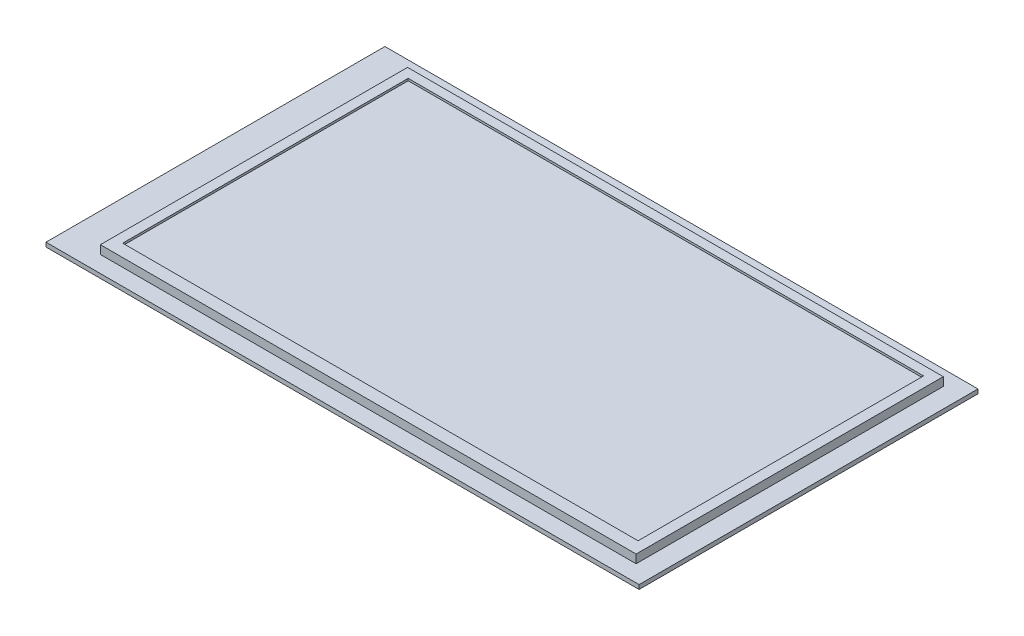
ISO-10303-21;
HEADER;
FILE_DESCRIPTION(('STEP AP214'),'2;1');
FILE_NAME('part.step','',(''),(''),'','','');
FILE_SCHEMA(('AUTOMOTIVE_DESIGN { 1 0 10303 214 1 1 1 1 }'));
ENDSEC;
DATA;
#1=APPLICATION_CONTEXT('core data for automotive mechanical design processes');
#2=APPLICATION_PROTOCOL_DEFINITION('international standard','automotive_design',2000,#1);
#3=PRODUCT_CONTEXT('',#1,'mechanical');
#4=PRODUCT('Part','Part','',(#3));
#5=PRODUCT_RELATED_PRODUCT_CATEGORY('part','',(#4));
#6=PRODUCT_DEFINITION_FORMATION('','',#4);
#7=PRODUCT_DEFINITION_CONTEXT('part definition',#1,'design');
#8=PRODUCT_DEFINITION('design','',#6,#7);
#9=PRODUCT_DEFINITION_SHAPE('','',#8);
#10=(LENGTH_UNIT() NAMED_UNIT(*) SI_UNIT(.MILLI.,.METRE.));
#11=(NAMED_UNIT(*) PLANE_ANGLE_UNIT() SI_UNIT($,.RADIAN.));
#12=(NAMED_UNIT(*) SI_UNIT($,.STERADIAN.) SOLID_ANGLE_UNIT());
#13=UNCERTAINTY_MEASURE_WITH_UNIT(LENGTH_MEASURE(1.E-05),#10,'distance_accuracy_value','');
#14=(GEOMETRIC_REPRESENTATION_CONTEXT(3) GLOBAL_UNCERTAINTY_ASSIGNED_CONTEXT((#13)) GLOBAL_UNIT_ASSIGNED_CONTEXT((#10,
#11,#12)) REPRESENTATION_CONTEXT('',''));
#15=CARTESIAN_POINT('',(0.,0.,0.));
#16=DIRECTION('',(0.,0.,1.));
#17=DIRECTION('',(1.,0.,0.));
#18=AXIS2_PLACEMENT_3D('',#15,#16,#17);
#19=CARTESIAN_POINT('',(0.,1.,0.));
#20=DIRECTION('',(1.,0.,0.));
#21=DIRECTION('',(0.,0.,-1.));
#22=AXIS2_PLACEMENT_3D('',#19,#20,#21);
#23=PLANE('',#22);
#24=DIRECTION('',(0.,0.,1.));
#25=VECTOR('',#24,1.);
#26=CARTESIAN_POINT('',(0.,0.,0.));
#27=LINE('',#26,#25);
#28=CARTESIAN_POINT('',(0.,0.,0.));
#29=VERTEX_POINT('',#28);
#30=CARTESIAN_POINT('',(0.,0.,80.));
#31=VERTEX_POINT('',#30);
#32=EDGE_CURVE('E202',#29,#31,#27,.T.);
#33=ORIENTED_EDGE('',*,*,#32,.T.);
#34=DIRECTION('',(0.,-1.,0.));
#35=VECTOR('',#34,1.);
#36=CARTESIAN_POINT('',(0.,1.,80.));
#37=LINE('',#36,#35);
#38=CARTESIAN_POINT('',(0.,1.,80.));
#39=VERTEX_POINT('',#38);
#40=EDGE_CURVE('E11',#39,#31,#37,.T.);
#41=ORIENTED_EDGE('',*,*,#40,.F.);
#42=DIRECTION('',(0.,0.,1.));
#43=VECTOR('',#42,1.);
#44=CARTESIAN_POINT('',(0.,1.,0.));
#45=LINE('',#44,#43);
#46=CARTESIAN_POINT('',(0.,1.,0.));
#47=VERTEX_POINT('',#46);
#48=EDGE_CURVE('E203',#47,#39,#45,.T.);
#49=ORIENTED_EDGE('',*,*,#48,.F.);
#50=DIRECTION('',(0.,-1.,0.));
#51=VECTOR('',#50,1.);
#52=CARTESIAN_POINT('',(0.,1.,0.));
#53=LINE('',#52,#51);
#54=EDGE_CURVE('E213',#47,#29,#53,.T.);
#55=ORIENTED_EDGE('',*,*,#54,.T.);
#56=EDGE_LOOP('',(#33,#41,#49,#55));
#57=FACE_BOUND('',#56,.T.);
#58=ADVANCED_FACE('F46',(#57),#23,.F.);
#59=CARTESIAN_POINT('',(0.,1.,80.));
#60=DIRECTION('',(0.,0.,-1.));
#61=DIRECTION('',(-1.,0.,0.));
#62=AXIS2_PLACEMENT_3D('',#59,#60,#61);
#63=PLANE('',#62);
#64=DIRECTION('',(1.,0.,0.));
#65=VECTOR('',#64,1.);
#66=CARTESIAN_POINT('',(0.,0.,80.));
#67=LINE('',#66,#65);
#68=CARTESIAN_POINT('',(140.,0.,80.));
#69=VERTEX_POINT('',#68);
#70=EDGE_CURVE('E216',#31,#69,#67,.T.);
#71=ORIENTED_EDGE('',*,*,#70,.T.);
#72=DIRECTION('',(0.,-1.,0.));
#73=VECTOR('',#72,1.);
#74=CARTESIAN_POINT('',(140.,1.,80.));
#75=LINE('',#74,#73);
#76=CARTESIAN_POINT('',(140.,1.,80.));
#77=VERTEX_POINT('',#76);
#78=EDGE_CURVE('E53',#77,#69,#75,.T.);
#79=ORIENTED_EDGE('',*,*,#78,.F.);
#80=DIRECTION('',(1.,0.,0.));
#81=VECTOR('',#80,1.);
#82=CARTESIAN_POINT('',(0.,1.,80.));
#83=LINE('',#82,#81);
#84=EDGE_CURVE('E206',#39,#77,#83,.T.);
#85=ORIENTED_EDGE('',*,*,#84,.F.);
#86=ORIENTED_EDGE('',*,*,#40,.T.);
#87=EDGE_LOOP('',(#71,#79,#85,#86));
#88=FACE_BOUND('',#87,.T.);
#89=ADVANCED_FACE('F246',(#88),#63,.F.);
#90=CARTESIAN_POINT('',(140.,1.,0.));
#91=DIRECTION('',(-1.,0.,0.));
#92=DIRECTION('',(0.,0.,1.));
#93=AXIS2_PLACEMENT_3D('',#90,#91,#92);
#94=PLANE('',#93);
#95=DIRECTION('',(0.,0.,-1.));
#96=VECTOR('',#95,1.);
#97=CARTESIAN_POINT('',(140.,0.,0.));
#98=LINE('',#97,#96);
#99=CARTESIAN_POINT('',(140.,0.,0.));
#100=VERTEX_POINT('',#99);
#101=EDGE_CURVE('E218',#69,#100,#98,.T.);
#102=ORIENTED_EDGE('',*,*,#101,.T.);
#103=DIRECTION('',(0.,-1.,0.));
#104=VECTOR('',#103,1.);
#105=CARTESIAN_POINT('',(140.,1.,0.));
#106=LINE('',#105,#104);
#107=CARTESIAN_POINT('',(140.,1.,0.));
#108=VERTEX_POINT('',#107);
#109=EDGE_CURVE('E223',#108,#100,#106,.T.);
#110=ORIENTED_EDGE('',*,*,#109,.F.);
#111=DIRECTION('',(0.,0.,-1.));
#112=VECTOR('',#111,1.);
#113=CARTESIAN_POINT('',(140.,1.,0.));
#114=LINE('',#113,#112);
#115=EDGE_CURVE('E209',#77,#108,#114,.T.);
#116=ORIENTED_EDGE('',*,*,#115,.F.);
#117=ORIENTED_EDGE('',*,*,#78,.T.);
#118=EDGE_LOOP('',(#102,#110,#116,#117));
#119=FACE_BOUND('',#118,.T.);
#120=ADVANCED_FACE('F230',(#119),#94,.F.);
#121=CARTESIAN_POINT('',(0.,1.,0.));
#122=DIRECTION('',(0.,0.,1.));
#123=DIRECTION('',(1.,0.,0.));
#124=AXIS2_PLACEMENT_3D('',#121,#122,#123);
#125=PLANE('',#124);
#126=DIRECTION('',(-1.,0.,0.));
#127=VECTOR('',#126,1.);
#128=CARTESIAN_POINT('',(0.,0.,0.));
#129=LINE('',#128,#127);
#130=EDGE_CURVE('E207',#100,#29,#129,.T.);
#131=ORIENTED_EDGE('',*,*,#130,.T.);
#132=ORIENTED_EDGE('',*,*,#54,.F.);
#133=DIRECTION('',(-1.,0.,0.));
#134=VECTOR('',#133,1.);
#135=CARTESIAN_POINT('',(0.,1.,0.));
#136=LINE('',#135,#134);
#137=EDGE_CURVE('E211',#108,#47,#136,.T.);
#138=ORIENTED_EDGE('',*,*,#137,.F.);
#139=ORIENTED_EDGE('',*,*,#109,.T.);
#140=EDGE_LOOP('',(#131,#132,#138,#139));
#141=FACE_BOUND('',#140,.T.);
#142=ADVANCED_FACE('F239',(#141),#125,.F.);
#143=CARTESIAN_POINT('',(0.,1.,0.));
#144=DIRECTION('',(0.,1.,0.));
#145=DIRECTION('',(0.,0.,1.));
#146=AXIS2_PLACEMENT_3D('',#143,#144,#145);
#147=PLANE('',#146);
#148=DIRECTION('',(0.,0.,1.));
#149=VECTOR('',#148,1.);
#150=CARTESIAN_POINT('',(8.93500924885776,1.,3.5928979192557));
#151=LINE('',#150,#149);
#152=CARTESIAN_POINT('',(8.93500924885776,1.,3.5928979192557));
#153=VERTEX_POINT('',#152);
#154=CARTESIAN_POINT('',(8.93500924885777,1.,76.0979122541562));
#155=VERTEX_POINT('',#154);
#156=EDGE_CURVE('E68',#153,#155,#151,.T.);
#157=ORIENTED_EDGE('',*,*,#156,.F.);
#158=DIRECTION('',(-1.,0.,0.));
#159=VECTOR('',#158,1.);
#160=CARTESIAN_POINT('',(8.93500924885776,1.,3.5928979192557));
#161=LINE('',#160,#159);
#162=CARTESIAN_POINT('',(135.393648323375,1.,3.5928979192557));
#163=VERTEX_POINT('',#162);
#164=EDGE_CURVE('E176',#163,#153,#161,.T.);
#165=ORIENTED_EDGE('',*,*,#164,.F.);
#166=DIRECTION('',(0.,0.,-1.));
#167=VECTOR('',#166,1.);
#168=CARTESIAN_POINT('',(135.393648323375,1.,3.5928979192557));
#169=LINE('',#168,#167);
#170=CARTESIAN_POINT('',(135.393648323375,1.,76.0979122541562));
#171=VERTEX_POINT('',#170);
#172=EDGE_CURVE('E187',#171,#163,#169,.T.);
#173=ORIENTED_EDGE('',*,*,#172,.F.);
#174=DIRECTION('',(1.,0.,0.));
#175=VECTOR('',#174,1.);
#176=CARTESIAN_POINT('',(8.93500924885777,1.,76.0979122541562));
#177=LINE('',#176,#175);
#178=EDGE_CURVE('E184',#155,#171,#177,.T.);
#179=ORIENTED_EDGE('',*,*,#178,.F.);
#180=EDGE_LOOP('',(#157,#165,#173,#179));
#181=FACE_BOUND('',#180,.T.);
#182=ORIENTED_EDGE('',*,*,#48,.T.);
#183=ORIENTED_EDGE('',*,*,#84,.T.);
#184=ORIENTED_EDGE('',*,*,#115,.T.);
#185=ORIENTED_EDGE('',*,*,#137,.T.);
#186=EDGE_LOOP('',(#182,#183,#184,#185));
#187=FACE_BOUND('',#186,.T.);
#188=ADVANCED_FACE('F245',(#181,#187),#147,.T.);
#189=CARTESIAN_POINT('',(0.,0.,0.));
#190=DIRECTION('',(0.,1.,0.));
#191=DIRECTION('',(0.,0.,1.));
#192=AXIS2_PLACEMENT_3D('',#189,#190,#191);
#193=PLANE('',#192);
#194=ORIENTED_EDGE('',*,*,#32,.F.);
#195=ORIENTED_EDGE('',*,*,#130,.F.);
#196=ORIENTED_EDGE('',*,*,#101,.F.);
#197=ORIENTED_EDGE('',*,*,#70,.F.);
#198=EDGE_LOOP('',(#194,#195,#196,#197));
#199=FACE_BOUND('',#198,.T.);
#200=ADVANCED_FACE('F236',(#199),#193,.F.);
#201=CARTESIAN_POINT('',(8.93500924885776,3.,3.5928979192557));
#202=DIRECTION('',(1.,0.,0.));
#203=DIRECTION('',(0.,0.,-1.));
#204=AXIS2_PLACEMENT_3D('',#201,#202,#203);
#205=PLANE('',#204);
#206=ORIENTED_EDGE('',*,*,#156,.T.);
#207=DIRECTION('',(0.,-1.,0.));
#208=VECTOR('',#207,1.);
#209=CARTESIAN_POINT('',(8.93500924885777,3.,76.0979122541562));
#210=LINE('',#209,#208);
#211=CARTESIAN_POINT('',(8.93500924885777,3.,76.0979122541562));
#212=VERTEX_POINT('',#211);
#213=EDGE_CURVE('E199',#212,#155,#210,.T.);
#214=ORIENTED_EDGE('',*,*,#213,.F.);
#215=DIRECTION('',(0.,0.,1.));
#216=VECTOR('',#215,1.);
#217=CARTESIAN_POINT('',(8.93500924885776,3.,3.5928979192557));
#218=LINE('',#217,#216);
#219=CARTESIAN_POINT('',(8.93500924885776,3.,3.5928979192557));
#220=VERTEX_POINT('',#219);
#221=EDGE_CURVE('E172',#220,#212,#218,.T.);
#222=ORIENTED_EDGE('',*,*,#221,.F.);
#223=DIRECTION('',(0.,-1.,0.));
#224=VECTOR('',#223,1.);
#225=CARTESIAN_POINT('',(8.93500924885776,3.,3.5928979192557));
#226=LINE('',#225,#224);
#227=EDGE_CURVE('E182',#220,#153,#226,.T.);
#228=ORIENTED_EDGE('',*,*,#227,.T.);
#229=EDGE_LOOP('',(#206,#214,#222,#228));
#230=FACE_BOUND('',#229,.T.);
#231=ADVANCED_FACE('F258',(#230),#205,.F.);
#232=CARTESIAN_POINT('',(8.93500924885777,3.,76.0979122541562));
#233=DIRECTION('',(0.,0.,-1.));
#234=DIRECTION('',(-1.,0.,0.));
#235=AXIS2_PLACEMENT_3D('',#232,#233,#234);
#236=PLANE('',#235);
#237=ORIENTED_EDGE('',*,*,#178,.T.);
#238=DIRECTION('',(0.,-1.,0.));
#239=VECTOR('',#238,1.);
#240=CARTESIAN_POINT('',(135.393648323375,3.,76.0979122541562));
#241=LINE('',#240,#239);
#242=CARTESIAN_POINT('',(135.393648323375,3.,76.0979122541562));
#243=VERTEX_POINT('',#242);
#244=EDGE_CURVE('E196',#243,#171,#241,.T.);
#245=ORIENTED_EDGE('',*,*,#244,.F.);
#246=DIRECTION('',(1.,0.,0.));
#247=VECTOR('',#246,1.);
#248=CARTESIAN_POINT('',(8.93500924885777,3.,76.0979122541562));
#249=LINE('',#248,#247);
#250=EDGE_CURVE('E175',#212,#243,#249,.T.);
#251=ORIENTED_EDGE('',*,*,#250,.F.);
#252=ORIENTED_EDGE('',*,*,#213,.T.);
#253=EDGE_LOOP('',(#237,#245,#251,#252));
#254=FACE_BOUND('',#253,.T.);
#255=ADVANCED_FACE('F263',(#254),#236,.F.);
#256=CARTESIAN_POINT('',(135.393648323375,3.,3.5928979192557));
#257=DIRECTION('',(-1.,0.,0.));
#258=DIRECTION('',(0.,0.,1.));
#259=AXIS2_PLACEMENT_3D('',#256,#257,#258);
#260=PLANE('',#259);
#261=ORIENTED_EDGE('',*,*,#172,.T.);
#262=DIRECTION('',(0.,-1.,0.));
#263=VECTOR('',#262,1.);
#264=CARTESIAN_POINT('',(135.393648323375,3.,3.5928979192557));
#265=LINE('',#264,#263);
#266=CARTESIAN_POINT('',(135.393648323375,3.,3.5928979192557));
#267=VERTEX_POINT('',#266);
#268=EDGE_CURVE('E193',#267,#163,#265,.T.);
#269=ORIENTED_EDGE('',*,*,#268,.F.);
#270=DIRECTION('',(0.,0.,-1.));
#271=VECTOR('',#270,1.);
#272=CARTESIAN_POINT('',(135.393648323375,3.,3.5928979192557));
#273=LINE('',#272,#271);
#274=EDGE_CURVE('E178',#243,#267,#273,.T.);
#275=ORIENTED_EDGE('',*,*,#274,.F.);
#276=ORIENTED_EDGE('',*,*,#244,.T.);
#277=EDGE_LOOP('',(#261,#269,#275,#276));
#278=FACE_BOUND('',#277,.T.);
#279=ADVANCED_FACE('F267',(#278),#260,.F.);
#280=CARTESIAN_POINT('',(8.93500924885776,3.,3.5928979192557));
#281=DIRECTION('',(0.,0.,1.));
#282=DIRECTION('',(1.,0.,0.));
#283=AXIS2_PLACEMENT_3D('',#280,#281,#282);
#284=PLANE('',#283);
#285=ORIENTED_EDGE('',*,*,#164,.T.);
#286=ORIENTED_EDGE('',*,*,#227,.F.);
#287=DIRECTION('',(-1.,0.,0.));
#288=VECTOR('',#287,1.);
#289=CARTESIAN_POINT('',(8.93500924885776,3.,3.5928979192557));
#290=LINE('',#289,#288);
#291=EDGE_CURVE('E180',#267,#220,#290,.T.);
#292=ORIENTED_EDGE('',*,*,#291,.F.);
#293=ORIENTED_EDGE('',*,*,#268,.T.);
#294=EDGE_LOOP('',(#285,#286,#292,#293));
#295=FACE_BOUND('',#294,.T.);
#296=ADVANCED_FACE('F271',(#295),#284,.F.);
#297=CARTESIAN_POINT('',(0.,3.,0.));
#298=DIRECTION('',(0.,1.,0.));
#299=DIRECTION('',(0.,0.,1.));
#300=AXIS2_PLACEMENT_3D('',#297,#298,#299);
#301=PLANE('',#300);
#302=DIRECTION('',(1.,0.,0.));
#303=VECTOR('',#302,1.);
#304=CARTESIAN_POINT('',(11.2539329482682,3.,73.1606089015696));
#305=LINE('',#304,#303);
#306=CARTESIAN_POINT('',(11.2539329482682,3.,73.1606089015696));
#307=VERTEX_POINT('',#306);
#308=CARTESIAN_POINT('',(132.920129710671,3.,73.1606089015696));
#309=VERTEX_POINT('',#308);
#310=EDGE_CURVE('E60',#307,#309,#305,.T.);
#311=ORIENTED_EDGE('',*,*,#310,.F.);
#312=DIRECTION('',(0.,0.,1.));
#313=VECTOR('',#312,1.);
#314=CARTESIAN_POINT('',(11.2539329482682,3.,5.75722670537213));
#315=LINE('',#314,#313);
#316=CARTESIAN_POINT('',(11.2539329482682,3.,5.75722670537213));
#317=VERTEX_POINT('',#316);
#318=EDGE_CURVE('E154',#317,#307,#315,.T.);
#319=ORIENTED_EDGE('',*,*,#318,.F.);
#320=DIRECTION('',(1.,0.,0.));
#321=VECTOR('',#320,1.);
#322=CARTESIAN_POINT('',(11.2539329482682,3.,5.75722670537213));
#323=LINE('',#322,#321);
#324=CARTESIAN_POINT('',(132.920129710671,3.,5.75722670537213));
#325=VERTEX_POINT('',#324);
#326=EDGE_CURVE('E157',#317,#325,#323,.T.);
#327=ORIENTED_EDGE('',*,*,#326,.T.);
#328=DIRECTION('',(0.,0.,1.));
#329=VECTOR('',#328,1.);
#330=CARTESIAN_POINT('',(132.920129710671,3.,5.75722670537213));
#331=LINE('',#330,#329);
#332=EDGE_CURVE('E163',#325,#309,#331,.T.);
#333=ORIENTED_EDGE('',*,*,#332,.T.);
#334=EDGE_LOOP('',(#311,#319,#327,#333));
#335=FACE_BOUND('',#334,.T.);
#336=ORIENTED_EDGE('',*,*,#221,.T.);
#337=ORIENTED_EDGE('',*,*,#250,.T.);
#338=ORIENTED_EDGE('',*,*,#274,.T.);
#339=ORIENTED_EDGE('',*,*,#291,.T.);
#340=EDGE_LOOP('',(#336,#337,#338,#339));
#341=FACE_BOUND('',#340,.T.);
#342=ADVANCED_FACE('F275',(#335,#341),#301,.T.);
#343=CARTESIAN_POINT('',(11.2539329482682,2.5,73.1606089015696));
#344=DIRECTION('',(0.,0.,1.));
#345=DIRECTION('',(1.,0.,0.));
#346=AXIS2_PLACEMENT_3D('',#343,#344,#345);
#347=PLANE('',#346);
#348=ORIENTED_EDGE('',*,*,#310,.T.);
#349=DIRECTION('',(0.,1.,0.));
#350=VECTOR('',#349,1.);
#351=CARTESIAN_POINT('',(132.920129710671,2.5,73.1606089015696));
#352=LINE('',#351,#350);
#353=CARTESIAN_POINT('',(132.920129710671,2.5,73.1606089015696));
#354=VERTEX_POINT('',#353);
#355=EDGE_CURVE('E138',#354,#309,#352,.T.);
#356=ORIENTED_EDGE('',*,*,#355,.F.);
#357=DIRECTION('',(1.,0.,0.));
#358=VECTOR('',#357,1.);
#359=CARTESIAN_POINT('',(11.2539329482682,2.5,73.1606089015696));
#360=LINE('',#359,#358);
#361=CARTESIAN_POINT('',(11.2539329482682,2.5,73.1606089015696));
#362=VERTEX_POINT('',#361);
#363=EDGE_CURVE('E145',#362,#354,#360,.T.);
#364=ORIENTED_EDGE('',*,*,#363,.F.);
#365=DIRECTION('',(0.,1.,0.));
#366=VECTOR('',#365,1.);
#367=CARTESIAN_POINT('',(11.2539329482682,2.5,73.1606089015696));
#368=LINE('',#367,#366);
#369=EDGE_CURVE('E167',#362,#307,#368,.T.);
#370=ORIENTED_EDGE('',*,*,#369,.T.);
#371=EDGE_LOOP('',(#348,#356,#364,#370));
#372=FACE_BOUND('',#371,.T.);
#373=ADVANCED_FACE('F148',(#372),#347,.F.);
#374=CARTESIAN_POINT('',(11.2539329482682,2.5,5.75722670537213));
#375=DIRECTION('',(-1.,0.,0.));
#376=DIRECTION('',(0.,0.,1.));
#377=AXIS2_PLACEMENT_3D('',#374,#375,#376);
#378=PLANE('',#377);
#379=ORIENTED_EDGE('',*,*,#318,.T.);
#380=ORIENTED_EDGE('',*,*,#369,.F.);
#381=DIRECTION('',(0.,0.,1.));
#382=VECTOR('',#381,1.);
#383=CARTESIAN_POINT('',(11.2539329482682,2.5,5.75722670537213));
#384=LINE('',#383,#382);
#385=CARTESIAN_POINT('',(11.2539329482682,2.5,5.75722670537213));
#386=VERTEX_POINT('',#385);
#387=EDGE_CURVE('E150',#386,#362,#384,.T.);
#388=ORIENTED_EDGE('',*,*,#387,.F.);
#389=DIRECTION('',(0.,1.,0.));
#390=VECTOR('',#389,1.);
#391=CARTESIAN_POINT('',(11.2539329482682,2.5,5.75722670537213));
#392=LINE('',#391,#390);
#393=EDGE_CURVE('E169',#386,#317,#392,.T.);
#394=ORIENTED_EDGE('',*,*,#393,.T.);
#395=EDGE_LOOP('',(#379,#380,#388,#394));
#396=FACE_BOUND('',#395,.T.);
#397=ADVANCED_FACE('F282',(#396),#378,.F.);
#398=CARTESIAN_POINT('',(11.2539329482682,2.5,5.75722670537213));
#399=DIRECTION('',(0.,0.,1.));
#400=DIRECTION('',(1.,0.,0.));
#401=AXIS2_PLACEMENT_3D('',#398,#399,#400);
#402=PLANE('',#401);
#403=ORIENTED_EDGE('',*,*,#326,.F.);
#404=ORIENTED_EDGE('',*,*,#393,.F.);
#405=DIRECTION('',(1.,0.,0.));
#406=VECTOR('',#405,1.);
#407=CARTESIAN_POINT('',(11.2539329482682,2.5,5.75722670537213));
#408=LINE('',#407,#406);
#409=CARTESIAN_POINT('',(132.920129710671,2.5,5.75722670537213));
#410=VERTEX_POINT('',#409);
#411=EDGE_CURVE('E144',#386,#410,#408,.T.);
#412=ORIENTED_EDGE('',*,*,#411,.T.);
#413=DIRECTION('',(0.,1.,0.));
#414=VECTOR('',#413,1.);
#415=CARTESIAN_POINT('',(132.920129710671,2.5,5.75722670537213));
#416=LINE('',#415,#414);
#417=EDGE_CURVE('E140',#410,#325,#416,.T.);
#418=ORIENTED_EDGE('',*,*,#417,.T.);
#419=EDGE_LOOP('',(#403,#404,#412,#418));
#420=FACE_BOUND('',#419,.T.);
#421=ADVANCED_FACE('F285',(#420),#402,.T.);
#422=CARTESIAN_POINT('',(132.920129710671,2.5,5.75722670537213));
#423=DIRECTION('',(-1.,0.,0.));
#424=DIRECTION('',(0.,0.,1.));
#425=AXIS2_PLACEMENT_3D('',#422,#423,#424);
#426=PLANE('',#425);
#427=ORIENTED_EDGE('',*,*,#332,.F.);
#428=ORIENTED_EDGE('',*,*,#417,.F.);
#429=DIRECTION('',(0.,0.,1.));
#430=VECTOR('',#429,1.);
#431=CARTESIAN_POINT('',(132.920129710671,2.5,5.75722670537213));
#432=LINE('',#431,#430);
#433=EDGE_CURVE('E135',#410,#354,#432,.T.);
#434=ORIENTED_EDGE('',*,*,#433,.T.);
#435=ORIENTED_EDGE('',*,*,#355,.T.);
#436=EDGE_LOOP('',(#427,#428,#434,#435));
#437=FACE_BOUND('',#436,.T.);
#438=ADVANCED_FACE('F137',(#437),#426,.T.);
#439=CARTESIAN_POINT('',(0.,2.5,0.));
#440=DIRECTION('',(0.,-1.,0.));
#441=DIRECTION('',(0.,0.,-1.));
#442=AXIS2_PLACEMENT_3D('',#439,#440,#441);
#443=PLANE('',#442);
#444=ORIENTED_EDGE('',*,*,#363,.T.);
#445=ORIENTED_EDGE('',*,*,#433,.F.);
#446=ORIENTED_EDGE('',*,*,#411,.F.);
#447=ORIENTED_EDGE('',*,*,#387,.T.);
#448=EDGE_LOOP('',(#444,#445,#446,#447));
#449=FACE_BOUND('',#448,.T.);
#450=ADVANCED_FACE('F152',(#449),#443,.F.);
#451=CLOSED_SHELL('',(#58,#89,#120,#142,#188,#200,#231,#255,#279,#296,#342,#373,#397,#421,#438,#450));
#452=MANIFOLD_SOLID_BREP('B2',#451);
#453=ADVANCED_BREP_SHAPE_REPRESENTATION('',(#18,#452),#14);
#454=SHAPE_DEFINITION_REPRESENTATION(#9,#453);
ENDSEC;
END-ISO-10303-21;
